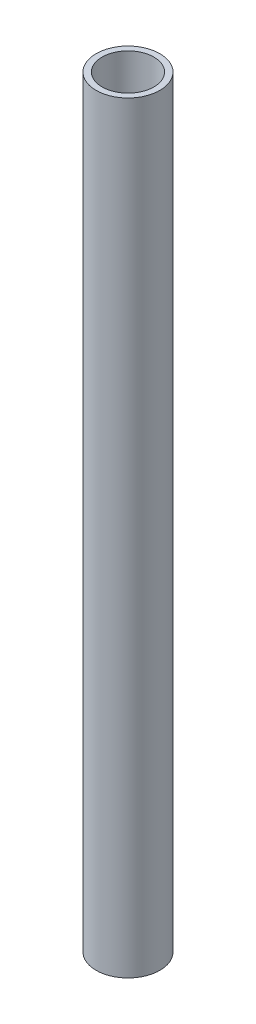
ISO-10303-21;
HEADER;
FILE_DESCRIPTION(('STEP AP214'),'2;1');
FILE_NAME('part.step','',(''),(''),'','','');
FILE_SCHEMA(('AUTOMOTIVE_DESIGN { 1 0 10303 214 1 1 1 1 }'));
ENDSEC;
DATA;
#1=APPLICATION_CONTEXT('core data for automotive mechanical design processes');
#2=APPLICATION_PROTOCOL_DEFINITION('international standard','automotive_design',2000,#1);
#3=PRODUCT_CONTEXT('',#1,'mechanical');
#4=PRODUCT('Part','Part','',(#3));
#5=PRODUCT_RELATED_PRODUCT_CATEGORY('part','',(#4));
#6=PRODUCT_DEFINITION_FORMATION('','',#4);
#7=PRODUCT_DEFINITION_CONTEXT('part definition',#1,'design');
#8=PRODUCT_DEFINITION('design','',#6,#7);
#9=PRODUCT_DEFINITION_SHAPE('','',#8);
#10=(LENGTH_UNIT() NAMED_UNIT(*) SI_UNIT(.MILLI.,.METRE.));
#11=(NAMED_UNIT(*) PLANE_ANGLE_UNIT() SI_UNIT($,.RADIAN.));
#12=(NAMED_UNIT(*) SI_UNIT($,.STERADIAN.) SOLID_ANGLE_UNIT());
#13=UNCERTAINTY_MEASURE_WITH_UNIT(LENGTH_MEASURE(1.E-05),#10,'distance_accuracy_value','');
#14=(GEOMETRIC_REPRESENTATION_CONTEXT(3) GLOBAL_UNCERTAINTY_ASSIGNED_CONTEXT((#13)) GLOBAL_UNIT_ASSIGNED_CONTEXT((#10,
#11,#12)) REPRESENTATION_CONTEXT('',''));
#15=CARTESIAN_POINT('',(0.,0.,0.));
#16=DIRECTION('',(0.,0.,1.));
#17=DIRECTION('',(1.,0.,0.));
#18=AXIS2_PLACEMENT_3D('',#15,#16,#17);
#19=CARTESIAN_POINT('',(0.,250.,0.));
#20=DIRECTION('',(0.,-1.,0.));
#21=DIRECTION('',(0.,0.,-1.));
#22=AXIS2_PLACEMENT_3D('',#19,#20,#21);
#23=CYLINDRICAL_SURFACE('',#22,10.45);
#24=CARTESIAN_POINT('',(0.,250.,0.));
#25=DIRECTION('',(0.,1.,0.));
#26=DIRECTION('',(0.,0.,1.));
#27=AXIS2_PLACEMENT_3D('',#24,#25,#26);
#28=CIRCLE('',#27,10.45);
#29=CARTESIAN_POINT('',(0.,250.,10.45));
#30=VERTEX_POINT('',#29);
#31=EDGE_CURVE('E10',#30,#30,#28,.T.);
#32=ORIENTED_EDGE('',*,*,#31,.F.);
#33=EDGE_LOOP('',(#32));
#34=FACE_BOUND('',#33,.T.);
#35=CARTESIAN_POINT('',(0.,0.,0.));
#36=DIRECTION('',(0.,1.,0.));
#37=DIRECTION('',(0.,0.,1.));
#38=AXIS2_PLACEMENT_3D('',#35,#36,#37);
#39=CIRCLE('',#38,10.45);
#40=CARTESIAN_POINT('',(0.,0.,10.45));
#41=VERTEX_POINT('',#40);
#42=EDGE_CURVE('E36',#41,#41,#39,.T.);
#43=ORIENTED_EDGE('',*,*,#42,.T.);
#44=EDGE_LOOP('',(#43));
#45=FACE_BOUND('',#44,.T.);
#46=ADVANCED_FACE('F33',(#34,#45),#23,.T.);
#47=CARTESIAN_POINT('',(0.,250.,0.));
#48=DIRECTION('',(0.,1.,0.));
#49=DIRECTION('',(0.,0.,1.));
#50=AXIS2_PLACEMENT_3D('',#47,#48,#49);
#51=PLANE('',#50);
#52=CARTESIAN_POINT('',(0.,250.,0.));
#53=DIRECTION('',(0.,-1.,0.));
#54=DIRECTION('',(0.,0.,-1.));
#55=AXIS2_PLACEMENT_3D('',#52,#53,#54);
#56=CIRCLE('',#55,8.5);
#57=CARTESIAN_POINT('',(0.,250.,-8.5));
#58=VERTEX_POINT('',#57);
#59=EDGE_CURVE('E43',#58,#58,#56,.T.);
#60=ORIENTED_EDGE('',*,*,#59,.T.);
#61=EDGE_LOOP('',(#60));
#62=FACE_BOUND('',#61,.T.);
#63=ORIENTED_EDGE('',*,*,#31,.T.);
#64=EDGE_LOOP('',(#63));
#65=FACE_BOUND('',#64,.T.);
#66=ADVANCED_FACE('F51',(#62,#65),#51,.T.);
#67=CARTESIAN_POINT('',(0.,0.,0.));
#68=DIRECTION('',(0.,1.,0.));
#69=DIRECTION('',(0.,0.,1.));
#70=AXIS2_PLACEMENT_3D('',#67,#68,#69);
#71=PLANE('',#70);
#72=CARTESIAN_POINT('',(0.,0.,0.));
#73=DIRECTION('',(0.,-1.,0.));
#74=DIRECTION('',(0.,0.,-1.));
#75=AXIS2_PLACEMENT_3D('',#72,#73,#74);
#76=CIRCLE('',#75,8.5);
#77=CARTESIAN_POINT('',(0.,0.,-8.5));
#78=VERTEX_POINT('',#77);
#79=EDGE_CURVE('E45',#78,#78,#76,.T.);
#80=ORIENTED_EDGE('',*,*,#79,.F.);
#81=EDGE_LOOP('',(#80));
#82=FACE_BOUND('',#81,.T.);
#83=ORIENTED_EDGE('',*,*,#42,.F.);
#84=EDGE_LOOP('',(#83));
#85=FACE_BOUND('',#84,.T.);
#86=ADVANCED_FACE('F56',(#82,#85),#71,.F.);
#87=CARTESIAN_POINT('',(0.,250.,0.));
#88=DIRECTION('',(0.,-1.,0.));
#89=DIRECTION('',(0.,0.,-1.));
#90=AXIS2_PLACEMENT_3D('',#87,#88,#89);
#91=CYLINDRICAL_SURFACE('',#90,8.5);
#92=ORIENTED_EDGE('',*,*,#59,.F.);
#93=EDGE_LOOP('',(#92));
#94=FACE_BOUND('',#93,.T.);
#95=ORIENTED_EDGE('',*,*,#79,.T.);
#96=EDGE_LOOP('',(#95));
#97=FACE_BOUND('',#96,.T.);
#98=ADVANCED_FACE('F53',(#94,#97),#91,.F.);
#99=CLOSED_SHELL('',(#46,#66,#86,#98));
#100=MANIFOLD_SOLID_BREP('B2',#99);
#101=ADVANCED_BREP_SHAPE_REPRESENTATION('',(#18,#100),#14);
#102=SHAPE_DEFINITION_REPRESENTATION(#9,#101);
ENDSEC;
END-ISO-10303-21;
